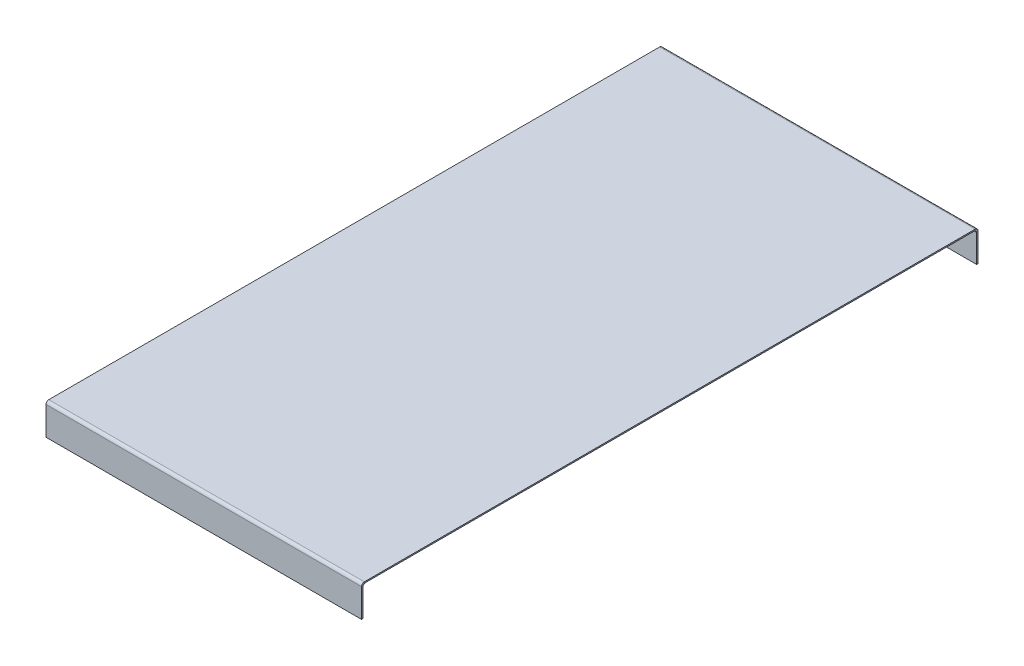
ISO-10303-21;
HEADER;
FILE_DESCRIPTION(('STEP AP214'),'2;1');
FILE_NAME('part.step','',(''),(''),'','','');
FILE_SCHEMA(('AUTOMOTIVE_DESIGN { 1 0 10303 214 1 1 1 1 }'));
ENDSEC;
DATA;
#1=APPLICATION_CONTEXT('core data for automotive mechanical design processes');
#2=APPLICATION_PROTOCOL_DEFINITION('international standard','automotive_design',2000,#1);
#3=PRODUCT_CONTEXT('',#1,'mechanical');
#4=PRODUCT('Part','Part','',(#3));
#5=PRODUCT_RELATED_PRODUCT_CATEGORY('part','',(#4));
#6=PRODUCT_DEFINITION_FORMATION('','',#4);
#7=PRODUCT_DEFINITION_CONTEXT('part definition',#1,'design');
#8=PRODUCT_DEFINITION('design','',#6,#7);
#9=PRODUCT_DEFINITION_SHAPE('','',#8);
#10=(LENGTH_UNIT() NAMED_UNIT(*) SI_UNIT(.MILLI.,.METRE.));
#11=(NAMED_UNIT(*) PLANE_ANGLE_UNIT() SI_UNIT($,.RADIAN.));
#12=(NAMED_UNIT(*) SI_UNIT($,.STERADIAN.) SOLID_ANGLE_UNIT());
#13=UNCERTAINTY_MEASURE_WITH_UNIT(LENGTH_MEASURE(1.E-05),#10,'distance_accuracy_value','');
#14=(GEOMETRIC_REPRESENTATION_CONTEXT(3) GLOBAL_UNCERTAINTY_ASSIGNED_CONTEXT((#13)) GLOBAL_UNIT_ASSIGNED_CONTEXT((#10,
#11,#12)) REPRESENTATION_CONTEXT('',''));
#15=CARTESIAN_POINT('',(0.,0.,0.));
#16=DIRECTION('',(0.,0.,1.));
#17=DIRECTION('',(1.,0.,0.));
#18=AXIS2_PLACEMENT_3D('',#15,#16,#17);
#19=CARTESIAN_POINT('',(225.,-87.4593323878921,24.797072277026));
#20=DIRECTION('',(0.,1.,0.));
#21=DIRECTION('',(0.,0.,1.));
#22=AXIS2_PLACEMENT_3D('',#19,#20,#21);
#23=PLANE('',#22);
#24=DIRECTION('',(0.,0.,-1.));
#25=VECTOR('',#24,1.);
#26=CARTESIAN_POINT('',(0.,-87.4593323878921,24.797072277026));
#27=LINE('',#26,#25);
#28=CARTESIAN_POINT('',(0.,-87.4593323878921,25.797072277026));
#29=VERTEX_POINT('',#28);
#30=CARTESIAN_POINT('',(0.,-87.4593323878921,24.797072277026));
#31=VERTEX_POINT('',#30);
#32=EDGE_CURVE('E149',#29,#31,#27,.T.);
#33=ORIENTED_EDGE('',*,*,#32,.T.);
#34=DIRECTION('',(-1.,0.,0.));
#35=VECTOR('',#34,1.);
#36=CARTESIAN_POINT('',(225.,-87.4593323878921,24.797072277026));
#37=LINE('',#36,#35);
#38=CARTESIAN_POINT('',(225.,-87.4593323878921,24.797072277026));
#39=VERTEX_POINT('',#38);
#40=EDGE_CURVE('E130',#39,#31,#37,.T.);
#41=ORIENTED_EDGE('',*,*,#40,.F.);
#42=DIRECTION('',(0.,0.,-1.));
#43=VECTOR('',#42,1.);
#44=CARTESIAN_POINT('',(225.,-87.4593323878921,24.797072277026));
#45=LINE('',#44,#43);
#46=CARTESIAN_POINT('',(225.,-87.4593323878921,25.797072277026));
#47=VERTEX_POINT('',#46);
#48=EDGE_CURVE('E136',#47,#39,#45,.T.);
#49=ORIENTED_EDGE('',*,*,#48,.F.);
#50=DIRECTION('',(-1.,0.,0.));
#51=VECTOR('',#50,1.);
#52=CARTESIAN_POINT('',(225.,-87.4593323878921,25.797072277026));
#53=LINE('',#52,#51);
#54=EDGE_CURVE('E217',#47,#29,#53,.T.);
#55=ORIENTED_EDGE('',*,*,#54,.T.);
#56=EDGE_LOOP('',(#33,#41,#49,#55));
#57=FACE_BOUND('',#56,.T.);
#58=ADVANCED_FACE('F37',(#57),#23,.F.);
#59=CARTESIAN_POINT('',(225.,-66.1303014087969,24.797072277026));
#60=DIRECTION('',(0.,0.,1.));
#61=DIRECTION('',(0.,-1.,0.));
#62=AXIS2_PLACEMENT_3D('',#59,#60,#61);
#63=PLANE('',#62);
#64=DIRECTION('',(0.,1.,0.));
#65=VECTOR('',#64,1.);
#66=CARTESIAN_POINT('',(0.,-66.1303014087969,24.797072277026));
#67=LINE('',#66,#65);
#68=CARTESIAN_POINT('',(0.,-68.1303014087969,24.797072277026));
#69=VERTEX_POINT('',#68);
#70=EDGE_CURVE('E199',#31,#69,#67,.T.);
#71=ORIENTED_EDGE('',*,*,#70,.T.);
#72=DIRECTION('',(-1.,0.,0.));
#73=VECTOR('',#72,1.);
#74=CARTESIAN_POINT('',(225.,-68.1303014087969,24.797072277026));
#75=LINE('',#74,#73);
#76=CARTESIAN_POINT('',(225.,-68.1303014087969,24.797072277026));
#77=VERTEX_POINT('',#76);
#78=EDGE_CURVE('E133',#69,#77,#75,.F.);
#79=ORIENTED_EDGE('',*,*,#78,.T.);
#80=DIRECTION('',(0.,1.,0.));
#81=VECTOR('',#80,1.);
#82=CARTESIAN_POINT('',(225.,-66.1303014087969,24.797072277026));
#83=LINE('',#82,#81);
#84=EDGE_CURVE('E125',#39,#77,#83,.T.);
#85=ORIENTED_EDGE('',*,*,#84,.F.);
#86=ORIENTED_EDGE('',*,*,#40,.T.);
#87=EDGE_LOOP('',(#71,#79,#85,#86));
#88=FACE_BOUND('',#87,.T.);
#89=ADVANCED_FACE('F128',(#88),#63,.F.);
#90=CARTESIAN_POINT('',(225.,-66.1303014087968,-412.812927722974));
#91=DIRECTION('',(0.,1.,0.));
#92=DIRECTION('',(0.,0.,1.));
#93=AXIS2_PLACEMENT_3D('',#90,#91,#92);
#94=PLANE('',#93);
#95=DIRECTION('',(0.,0.,-1.));
#96=VECTOR('',#95,1.);
#97=CARTESIAN_POINT('',(225.,-66.1303014087968,-412.812927722974));
#98=LINE('',#97,#96);
#99=CARTESIAN_POINT('',(225.,-66.1303014087969,22.797072277026));
#100=VERTEX_POINT('',#99);
#101=CARTESIAN_POINT('',(225.,-66.1303014087968,-410.812927722974));
#102=VERTEX_POINT('',#101);
#103=EDGE_CURVE('E135',#100,#102,#98,.T.);
#104=ORIENTED_EDGE('',*,*,#103,.F.);
#105=DIRECTION('',(-1.,0.,0.));
#106=VECTOR('',#105,1.);
#107=CARTESIAN_POINT('',(0.,-66.1303014087969,22.797072277026));
#108=LINE('',#107,#106);
#109=CARTESIAN_POINT('',(0.,-66.1303014087969,22.797072277026));
#110=VERTEX_POINT('',#109);
#111=EDGE_CURVE('E177',#100,#110,#108,.T.);
#112=ORIENTED_EDGE('',*,*,#111,.T.);
#113=DIRECTION('',(0.,0.,-1.));
#114=VECTOR('',#113,1.);
#115=CARTESIAN_POINT('',(0.,-66.1303014087968,-412.812927722974));
#116=LINE('',#115,#114);
#117=CARTESIAN_POINT('',(0.,-66.1303014087968,-410.812927722974));
#118=VERTEX_POINT('',#117);
#119=EDGE_CURVE('E192',#110,#118,#116,.T.);
#120=ORIENTED_EDGE('',*,*,#119,.T.);
#121=DIRECTION('',(-1.,0.,0.));
#122=VECTOR('',#121,1.);
#123=CARTESIAN_POINT('',(225.,-66.1303014087968,-410.812927722974));
#124=LINE('',#123,#122);
#125=EDGE_CURVE('E175',#118,#102,#124,.F.);
#126=ORIENTED_EDGE('',*,*,#125,.T.);
#127=EDGE_LOOP('',(#104,#112,#120,#126));
#128=FACE_BOUND('',#127,.T.);
#129=ADVANCED_FACE('F197',(#128),#94,.F.);
#130=CARTESIAN_POINT('',(225.,-87.5493323878921,-412.812927722974));
#131=DIRECTION('',(0.,0.,-1.));
#132=DIRECTION('',(0.,1.,0.));
#133=AXIS2_PLACEMENT_3D('',#130,#131,#132);
#134=PLANE('',#133);
#135=DIRECTION('',(0.,-1.,0.));
#136=VECTOR('',#135,1.);
#137=CARTESIAN_POINT('',(225.,-87.5493323878921,-412.812927722974));
#138=LINE('',#137,#136);
#139=CARTESIAN_POINT('',(225.,-68.1303014087968,-412.812927722974));
#140=VERTEX_POINT('',#139);
#141=CARTESIAN_POINT('',(225.,-87.5493323878921,-412.812927722974));
#142=VERTEX_POINT('',#141);
#143=EDGE_CURVE('E204',#140,#142,#138,.T.);
#144=ORIENTED_EDGE('',*,*,#143,.F.);
#145=DIRECTION('',(-1.,0.,0.));
#146=VECTOR('',#145,1.);
#147=CARTESIAN_POINT('',(0.,-68.1303014087968,-412.812927722974));
#148=LINE('',#147,#146);
#149=CARTESIAN_POINT('',(0.,-68.1303014087968,-412.812927722974));
#150=VERTEX_POINT('',#149);
#151=EDGE_CURVE('E181',#140,#150,#148,.T.);
#152=ORIENTED_EDGE('',*,*,#151,.T.);
#153=DIRECTION('',(0.,-1.,0.));
#154=VECTOR('',#153,1.);
#155=CARTESIAN_POINT('',(0.,-87.5493323878921,-412.812927722974));
#156=LINE('',#155,#154);
#157=CARTESIAN_POINT('',(0.,-87.5493323878921,-412.812927722974));
#158=VERTEX_POINT('',#157);
#159=EDGE_CURVE('E194',#150,#158,#156,.T.);
#160=ORIENTED_EDGE('',*,*,#159,.T.);
#161=DIRECTION('',(-1.,0.,0.));
#162=VECTOR('',#161,1.);
#163=CARTESIAN_POINT('',(225.,-87.5493323878921,-412.812927722974));
#164=LINE('',#163,#162);
#165=EDGE_CURVE('E151',#142,#158,#164,.T.);
#166=ORIENTED_EDGE('',*,*,#165,.F.);
#167=EDGE_LOOP('',(#144,#152,#160,#166));
#168=FACE_BOUND('',#167,.T.);
#169=ADVANCED_FACE('F202',(#168),#134,.F.);
#170=CARTESIAN_POINT('',(225.,-87.5493323878921,-413.812927722974));
#171=DIRECTION('',(0.,1.,0.));
#172=DIRECTION('',(0.,0.,1.));
#173=AXIS2_PLACEMENT_3D('',#170,#171,#172);
#174=PLANE('',#173);
#175=DIRECTION('',(0.,0.,-1.));
#176=VECTOR('',#175,1.);
#177=CARTESIAN_POINT('',(0.,-87.5493323878921,-413.812927722974));
#178=LINE('',#177,#176);
#179=CARTESIAN_POINT('',(0.,-87.5493323878921,-413.812927722974));
#180=VERTEX_POINT('',#179);
#181=EDGE_CURVE('E221',#158,#180,#178,.T.);
#182=ORIENTED_EDGE('',*,*,#181,.T.);
#183=DIRECTION('',(-1.,0.,0.));
#184=VECTOR('',#183,1.);
#185=CARTESIAN_POINT('',(225.,-87.5493323878921,-413.812927722974));
#186=LINE('',#185,#184);
#187=CARTESIAN_POINT('',(225.,-87.5493323878921,-413.812927722974));
#188=VERTEX_POINT('',#187);
#189=EDGE_CURVE('E156',#188,#180,#186,.T.);
#190=ORIENTED_EDGE('',*,*,#189,.F.);
#191=DIRECTION('',(0.,0.,-1.));
#192=VECTOR('',#191,1.);
#193=CARTESIAN_POINT('',(225.,-87.5493323878921,-413.812927722974));
#194=LINE('',#193,#192);
#195=EDGE_CURVE('E206',#142,#188,#194,.T.);
#196=ORIENTED_EDGE('',*,*,#195,.F.);
#197=ORIENTED_EDGE('',*,*,#165,.T.);
#198=EDGE_LOOP('',(#182,#190,#196,#197));
#199=FACE_BOUND('',#198,.T.);
#200=ADVANCED_FACE('F285',(#199),#174,.F.);
#201=CARTESIAN_POINT('',(225.,-65.2293323878921,-413.812927722974));
#202=DIRECTION('',(0.,0.,1.));
#203=DIRECTION('',(1.,0.,0.));
#204=AXIS2_PLACEMENT_3D('',#201,#202,#203);
#205=PLANE('',#204);
#206=DIRECTION('',(0.,1.,0.));
#207=VECTOR('',#206,1.);
#208=CARTESIAN_POINT('',(0.,-65.2293323878921,-413.812927722974));
#209=LINE('',#208,#207);
#210=CARTESIAN_POINT('',(0.,-67.2293323878921,-413.812927722974));
#211=VERTEX_POINT('',#210);
#212=EDGE_CURVE('E223',#180,#211,#209,.T.);
#213=ORIENTED_EDGE('',*,*,#212,.T.);
#214=DIRECTION('',(-1.,0.,0.));
#215=VECTOR('',#214,1.);
#216=CARTESIAN_POINT('',(225.,-67.2293323878921,-413.812927722974));
#217=LINE('',#216,#215);
#218=CARTESIAN_POINT('',(225.,-67.2293323878921,-413.812927722974));
#219=VERTEX_POINT('',#218);
#220=EDGE_CURVE('E166',#211,#219,#217,.F.);
#221=ORIENTED_EDGE('',*,*,#220,.T.);
#222=DIRECTION('',(0.,1.,0.));
#223=VECTOR('',#222,1.);
#224=CARTESIAN_POINT('',(225.,-65.2293323878921,-413.812927722974));
#225=LINE('',#224,#223);
#226=EDGE_CURVE('E208',#188,#219,#225,.T.);
#227=ORIENTED_EDGE('',*,*,#226,.F.);
#228=ORIENTED_EDGE('',*,*,#189,.T.);
#229=EDGE_LOOP('',(#213,#221,#227,#228));
#230=FACE_BOUND('',#229,.T.);
#231=ADVANCED_FACE('F235',(#230),#205,.F.);
#232=CARTESIAN_POINT('',(225.,-65.2293323878921,25.797072277026));
#233=DIRECTION('',(0.,-1.,0.));
#234=DIRECTION('',(0.,0.,-1.));
#235=AXIS2_PLACEMENT_3D('',#232,#233,#234);
#236=PLANE('',#235);
#237=DIRECTION('',(0.,0.,1.));
#238=VECTOR('',#237,1.);
#239=CARTESIAN_POINT('',(225.,-65.2293323878921,25.797072277026));
#240=LINE('',#239,#238);
#241=CARTESIAN_POINT('',(225.,-65.2293323878921,-411.812927722974));
#242=VERTEX_POINT('',#241);
#243=CARTESIAN_POINT('',(225.,-65.2293323878921,23.797072277026));
#244=VERTEX_POINT('',#243);
#245=EDGE_CURVE('E213',#242,#244,#240,.T.);
#246=ORIENTED_EDGE('',*,*,#245,.F.);
#247=DIRECTION('',(-1.,0.,0.));
#248=VECTOR('',#247,1.);
#249=CARTESIAN_POINT('',(225.,-65.2293323878921,-411.812927722974));
#250=LINE('',#249,#248);
#251=CARTESIAN_POINT('',(0.,-65.2293323878921,-411.812927722974));
#252=VERTEX_POINT('',#251);
#253=EDGE_CURVE('E153',#242,#252,#250,.T.);
#254=ORIENTED_EDGE('',*,*,#253,.T.);
#255=DIRECTION('',(0.,0.,1.));
#256=VECTOR('',#255,1.);
#257=CARTESIAN_POINT('',(0.,-65.2293323878921,25.797072277026));
#258=LINE('',#257,#256);
#259=CARTESIAN_POINT('',(0.,-65.2293323878921,23.797072277026));
#260=VERTEX_POINT('',#259);
#261=EDGE_CURVE('E226',#252,#260,#258,.T.);
#262=ORIENTED_EDGE('',*,*,#261,.T.);
#263=DIRECTION('',(-1.,0.,0.));
#264=VECTOR('',#263,1.);
#265=CARTESIAN_POINT('',(225.,-65.2293323878921,23.797072277026));
#266=LINE('',#265,#264);
#267=EDGE_CURVE('E150',#260,#244,#266,.F.);
#268=ORIENTED_EDGE('',*,*,#267,.T.);
#269=EDGE_LOOP('',(#246,#254,#262,#268));
#270=FACE_BOUND('',#269,.T.);
#271=ADVANCED_FACE('F244',(#270),#236,.F.);
#272=CARTESIAN_POINT('',(225.,-87.4593323878921,25.797072277026));
#273=DIRECTION('',(0.,0.,-1.));
#274=DIRECTION('',(-1.,0.,0.));
#275=AXIS2_PLACEMENT_3D('',#272,#273,#274);
#276=PLANE('',#275);
#277=DIRECTION('',(0.,-1.,0.));
#278=VECTOR('',#277,1.);
#279=CARTESIAN_POINT('',(225.,-87.4593323878921,25.797072277026));
#280=LINE('',#279,#278);
#281=CARTESIAN_POINT('',(225.,-67.2293323878921,25.797072277026));
#282=VERTEX_POINT('',#281);
#283=EDGE_CURVE('E142',#282,#47,#280,.T.);
#284=ORIENTED_EDGE('',*,*,#283,.F.);
#285=DIRECTION('',(-1.,0.,0.));
#286=VECTOR('',#285,1.);
#287=CARTESIAN_POINT('',(225.,-67.2293323878921,25.797072277026));
#288=LINE('',#287,#286);
#289=CARTESIAN_POINT('',(0.,-67.2293323878921,25.797072277026));
#290=VERTEX_POINT('',#289);
#291=EDGE_CURVE('E172',#282,#290,#288,.T.);
#292=ORIENTED_EDGE('',*,*,#291,.T.);
#293=DIRECTION('',(0.,-1.,0.));
#294=VECTOR('',#293,1.);
#295=CARTESIAN_POINT('',(0.,-87.4593323878921,25.797072277026));
#296=LINE('',#295,#294);
#297=EDGE_CURVE('E146',#290,#29,#296,.T.);
#298=ORIENTED_EDGE('',*,*,#297,.T.);
#299=ORIENTED_EDGE('',*,*,#54,.F.);
#300=EDGE_LOOP('',(#284,#292,#298,#299));
#301=FACE_BOUND('',#300,.T.);
#302=ADVANCED_FACE('F252',(#301),#276,.F.);
#303=CARTESIAN_POINT('',(225.,0.,0.));
#304=DIRECTION('',(-1.,0.,0.));
#305=DIRECTION('',(0.,0.,1.));
#306=AXIS2_PLACEMENT_3D('',#303,#304,#305);
#307=PLANE('',#306);
#308=ORIENTED_EDGE('',*,*,#226,.T.);
#309=CARTESIAN_POINT('',(225.,-67.2293323878921,-411.812927722974));
#310=DIRECTION('',(-1.,0.,0.));
#311=DIRECTION('',(0.,0.,1.));
#312=AXIS2_PLACEMENT_3D('',#309,#310,#311);
#313=CIRCLE('',#312,2.);
#314=EDGE_CURVE('E170',#219,#242,#313,.F.);
#315=ORIENTED_EDGE('',*,*,#314,.T.);
#316=ORIENTED_EDGE('',*,*,#245,.T.);
#317=CARTESIAN_POINT('',(225.,-67.2293323878921,23.797072277026));
#318=DIRECTION('',(-1.,0.,0.));
#319=DIRECTION('',(0.,0.,1.));
#320=AXIS2_PLACEMENT_3D('',#317,#318,#319);
#321=CIRCLE('',#320,2.);
#322=EDGE_CURVE('E168',#244,#282,#321,.F.);
#323=ORIENTED_EDGE('',*,*,#322,.T.);
#324=ORIENTED_EDGE('',*,*,#283,.T.);
#325=ORIENTED_EDGE('',*,*,#48,.T.);
#326=ORIENTED_EDGE('',*,*,#84,.T.);
#327=CARTESIAN_POINT('',(225.,-68.1303014087969,22.797072277026));
#328=DIRECTION('',(-1.,0.,0.));
#329=DIRECTION('',(0.,0.,1.));
#330=AXIS2_PLACEMENT_3D('',#327,#328,#329);
#331=CIRCLE('',#330,2.);
#332=EDGE_CURVE('E185',#77,#100,#331,.T.);
#333=ORIENTED_EDGE('',*,*,#332,.T.);
#334=ORIENTED_EDGE('',*,*,#103,.T.);
#335=CARTESIAN_POINT('',(225.,-68.1303014087968,-410.812927722974));
#336=DIRECTION('',(-1.,0.,0.));
#337=DIRECTION('',(0.,0.,1.));
#338=AXIS2_PLACEMENT_3D('',#335,#336,#337);
#339=CIRCLE('',#338,2.);
#340=EDGE_CURVE('E11',#102,#140,#339,.T.);
#341=ORIENTED_EDGE('',*,*,#340,.T.);
#342=ORIENTED_EDGE('',*,*,#143,.T.);
#343=ORIENTED_EDGE('',*,*,#195,.T.);
#344=EDGE_LOOP('',(#308,#315,#316,#323,#324,#325,#326,#333,#334,#341,#342,#343));
#345=FACE_BOUND('',#344,.T.);
#346=ADVANCED_FACE('F140',(#345),#307,.F.);
#347=CARTESIAN_POINT('',(0.,0.,0.));
#348=DIRECTION('',(-1.,0.,0.));
#349=DIRECTION('',(0.,0.,1.));
#350=AXIS2_PLACEMENT_3D('',#347,#348,#349);
#351=PLANE('',#350);
#352=ORIENTED_EDGE('',*,*,#261,.F.);
#353=CARTESIAN_POINT('',(0.,-67.2293323878921,-411.812927722974));
#354=DIRECTION('',(-1.,0.,0.));
#355=DIRECTION('',(0.,0.,1.));
#356=AXIS2_PLACEMENT_3D('',#353,#354,#355);
#357=CIRCLE('',#356,2.);
#358=EDGE_CURVE('E164',#252,#211,#357,.T.);
#359=ORIENTED_EDGE('',*,*,#358,.T.);
#360=ORIENTED_EDGE('',*,*,#212,.F.);
#361=ORIENTED_EDGE('',*,*,#181,.F.);
#362=ORIENTED_EDGE('',*,*,#159,.F.);
#363=CARTESIAN_POINT('',(0.,-68.1303014087968,-410.812927722974));
#364=DIRECTION('',(-1.,0.,0.));
#365=DIRECTION('',(0.,0.,1.));
#366=AXIS2_PLACEMENT_3D('',#363,#364,#365);
#367=CIRCLE('',#366,2.);
#368=EDGE_CURVE('E45',#150,#118,#367,.F.);
#369=ORIENTED_EDGE('',*,*,#368,.T.);
#370=ORIENTED_EDGE('',*,*,#119,.F.);
#371=CARTESIAN_POINT('',(0.,-68.1303014087969,22.797072277026));
#372=DIRECTION('',(-1.,0.,0.));
#373=DIRECTION('',(0.,0.,1.));
#374=AXIS2_PLACEMENT_3D('',#371,#372,#373);
#375=CIRCLE('',#374,2.);
#376=EDGE_CURVE('E183',#110,#69,#375,.F.);
#377=ORIENTED_EDGE('',*,*,#376,.T.);
#378=ORIENTED_EDGE('',*,*,#70,.F.);
#379=ORIENTED_EDGE('',*,*,#32,.F.);
#380=ORIENTED_EDGE('',*,*,#297,.F.);
#381=CARTESIAN_POINT('',(0.,-67.2293323878921,23.797072277026));
#382=DIRECTION('',(-1.,0.,0.));
#383=DIRECTION('',(0.,0.,1.));
#384=AXIS2_PLACEMENT_3D('',#381,#382,#383);
#385=CIRCLE('',#384,2.);
#386=EDGE_CURVE('E162',#290,#260,#385,.T.);
#387=ORIENTED_EDGE('',*,*,#386,.T.);
#388=EDGE_LOOP('',(#352,#359,#360,#361,#362,#369,#370,#377,#378,#379,#380,#387));
#389=FACE_BOUND('',#388,.T.);
#390=ADVANCED_FACE('F191',(#389),#351,.T.);
#391=CARTESIAN_POINT('',(225.,-67.2293323878921,-411.812927722974));
#392=DIRECTION('',(-1.,0.,0.));
#393=DIRECTION('',(0.,0.,1.));
#394=AXIS2_PLACEMENT_3D('',#391,#392,#393);
#395=CYLINDRICAL_SURFACE('',#394,2.);
#396=ORIENTED_EDGE('',*,*,#314,.F.);
#397=ORIENTED_EDGE('',*,*,#220,.F.);
#398=ORIENTED_EDGE('',*,*,#358,.F.);
#399=ORIENTED_EDGE('',*,*,#253,.F.);
#400=EDGE_LOOP('',(#396,#397,#398,#399));
#401=FACE_BOUND('',#400,.T.);
#402=ADVANCED_FACE('F241',(#401),#395,.T.);
#403=CARTESIAN_POINT('',(225.,-67.2293323878921,23.797072277026));
#404=DIRECTION('',(-1.,0.,0.));
#405=DIRECTION('',(0.,0.,1.));
#406=AXIS2_PLACEMENT_3D('',#403,#404,#405);
#407=CYLINDRICAL_SURFACE('',#406,2.);
#408=ORIENTED_EDGE('',*,*,#322,.F.);
#409=ORIENTED_EDGE('',*,*,#267,.F.);
#410=ORIENTED_EDGE('',*,*,#386,.F.);
#411=ORIENTED_EDGE('',*,*,#291,.F.);
#412=EDGE_LOOP('',(#408,#409,#410,#411));
#413=FACE_BOUND('',#412,.T.);
#414=ADVANCED_FACE('F249',(#413),#407,.T.);
#415=CARTESIAN_POINT('',(225.,-68.1303014087969,22.797072277026));
#416=DIRECTION('',(1.,0.,0.));
#417=DIRECTION('',(0.,0.,-1.));
#418=AXIS2_PLACEMENT_3D('',#415,#416,#417);
#419=CYLINDRICAL_SURFACE('',#418,2.);
#420=ORIENTED_EDGE('',*,*,#332,.F.);
#421=ORIENTED_EDGE('',*,*,#78,.F.);
#422=ORIENTED_EDGE('',*,*,#376,.F.);
#423=ORIENTED_EDGE('',*,*,#111,.F.);
#424=EDGE_LOOP('',(#420,#421,#422,#423));
#425=FACE_BOUND('',#424,.T.);
#426=ADVANCED_FACE('F254',(#425),#419,.F.);
#427=CARTESIAN_POINT('',(225.,-68.1303014087968,-410.812927722974));
#428=DIRECTION('',(1.,0.,0.));
#429=DIRECTION('',(0.,0.,-1.));
#430=AXIS2_PLACEMENT_3D('',#427,#428,#429);
#431=CYLINDRICAL_SURFACE('',#430,2.);
#432=ORIENTED_EDGE('',*,*,#340,.F.);
#433=ORIENTED_EDGE('',*,*,#125,.F.);
#434=ORIENTED_EDGE('',*,*,#368,.F.);
#435=ORIENTED_EDGE('',*,*,#151,.F.);
#436=EDGE_LOOP('',(#432,#433,#434,#435));
#437=FACE_BOUND('',#436,.T.);
#438=ADVANCED_FACE('F39',(#437),#431,.F.);
#439=CLOSED_SHELL('',(#58,#89,#129,#169,#200,#231,#271,#302,#346,#390,#402,#414,#426,#438));
#440=MANIFOLD_SOLID_BREP('B2',#439);
#441=ADVANCED_BREP_SHAPE_REPRESENTATION('',(#18,#440),#14);
#442=SHAPE_DEFINITION_REPRESENTATION(#9,#441);
ENDSEC;
END-ISO-10303-21;
